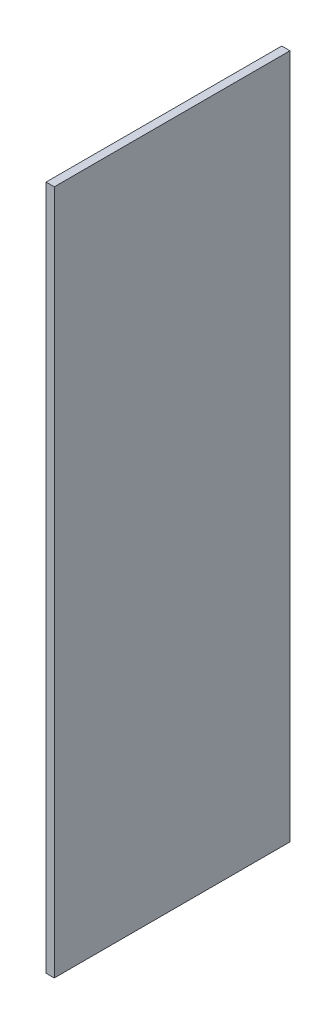
ISO-10303-21;
HEADER;
FILE_DESCRIPTION(('STEP AP214'),'2;1');
FILE_NAME('part.step','',(''),(''),'','','');
FILE_SCHEMA(('AUTOMOTIVE_DESIGN { 1 0 10303 214 1 1 1 1 }'));
ENDSEC;
DATA;
#1=APPLICATION_CONTEXT('core data for automotive mechanical design processes');
#2=APPLICATION_PROTOCOL_DEFINITION('international standard','automotive_design',2000,#1);
#3=PRODUCT_CONTEXT('',#1,'mechanical');
#4=PRODUCT('Part','Part','',(#3));
#5=PRODUCT_RELATED_PRODUCT_CATEGORY('part','',(#4));
#6=PRODUCT_DEFINITION_FORMATION('','',#4);
#7=PRODUCT_DEFINITION_CONTEXT('part definition',#1,'design');
#8=PRODUCT_DEFINITION('design','',#6,#7);
#9=PRODUCT_DEFINITION_SHAPE('','',#8);
#10=(LENGTH_UNIT() NAMED_UNIT(*) SI_UNIT(.MILLI.,.METRE.));
#11=(NAMED_UNIT(*) PLANE_ANGLE_UNIT() SI_UNIT($,.RADIAN.));
#12=(NAMED_UNIT(*) SI_UNIT($,.STERADIAN.) SOLID_ANGLE_UNIT());
#13=UNCERTAINTY_MEASURE_WITH_UNIT(LENGTH_MEASURE(1.E-05),#10,'distance_accuracy_value','');
#14=(GEOMETRIC_REPRESENTATION_CONTEXT(3) GLOBAL_UNCERTAINTY_ASSIGNED_CONTEXT((#13)) GLOBAL_UNIT_ASSIGNED_CONTEXT((#10,
#11,#12)) REPRESENTATION_CONTEXT('',''));
#15=CARTESIAN_POINT('',(0.,0.,0.));
#16=DIRECTION('',(0.,0.,1.));
#17=DIRECTION('',(1.,0.,0.));
#18=AXIS2_PLACEMENT_3D('',#15,#16,#17);
#19=CARTESIAN_POINT('',(3.,0.,0.));
#20=DIRECTION('',(0.,0.,-1.));
#21=DIRECTION('',(-1.,0.,0.));
#22=AXIS2_PLACEMENT_3D('',#19,#20,#21);
#23=PLANE('',#22);
#24=DIRECTION('',(0.,-1.,0.));
#25=VECTOR('',#24,1.);
#26=CARTESIAN_POINT('',(0.,0.,0.));
#27=LINE('',#26,#25);
#28=CARTESIAN_POINT('',(0.,250.,0.));
#29=VERTEX_POINT('',#28);
#30=CARTESIAN_POINT('',(0.,0.,0.));
#31=VERTEX_POINT('',#30);
#32=EDGE_CURVE('E96',#29,#31,#27,.T.);
#33=ORIENTED_EDGE('',*,*,#32,.T.);
#34=DIRECTION('',(-1.,0.,0.));
#35=VECTOR('',#34,1.);
#36=CARTESIAN_POINT('',(3.,0.,0.));
#37=LINE('',#36,#35);
#38=CARTESIAN_POINT('',(3.,0.,0.));
#39=VERTEX_POINT('',#38);
#40=EDGE_CURVE('E11',#39,#31,#37,.T.);
#41=ORIENTED_EDGE('',*,*,#40,.F.);
#42=DIRECTION('',(0.,-1.,0.));
#43=VECTOR('',#42,1.);
#44=CARTESIAN_POINT('',(3.,0.,0.));
#45=LINE('',#44,#43);
#46=CARTESIAN_POINT('',(3.,250.,0.));
#47=VERTEX_POINT('',#46);
#48=EDGE_CURVE('E84',#47,#39,#45,.T.);
#49=ORIENTED_EDGE('',*,*,#48,.F.);
#50=DIRECTION('',(-1.,0.,0.));
#51=VECTOR('',#50,1.);
#52=CARTESIAN_POINT('',(3.,250.,0.));
#53=LINE('',#52,#51);
#54=EDGE_CURVE('E92',#47,#29,#53,.T.);
#55=ORIENTED_EDGE('',*,*,#54,.T.);
#56=EDGE_LOOP('',(#33,#41,#49,#55));
#57=FACE_BOUND('',#56,.T.);
#58=ADVANCED_FACE('F33',(#57),#23,.F.);
#59=CARTESIAN_POINT('',(3.,0.,0.));
#60=DIRECTION('',(0.,1.,0.));
#61=DIRECTION('',(0.,0.,1.));
#62=AXIS2_PLACEMENT_3D('',#59,#60,#61);
#63=PLANE('',#62);
#64=DIRECTION('',(0.,0.,-1.));
#65=VECTOR('',#64,1.);
#66=CARTESIAN_POINT('',(0.,0.,0.));
#67=LINE('',#66,#65);
#68=CARTESIAN_POINT('',(0.,0.,-86.));
#69=VERTEX_POINT('',#68);
#70=EDGE_CURVE('E88',#31,#69,#67,.T.);
#71=ORIENTED_EDGE('',*,*,#70,.T.);
#72=DIRECTION('',(-1.,0.,0.));
#73=VECTOR('',#72,1.);
#74=CARTESIAN_POINT('',(3.,0.,-86.));
#75=LINE('',#74,#73);
#76=CARTESIAN_POINT('',(3.,0.,-86.));
#77=VERTEX_POINT('',#76);
#78=EDGE_CURVE('E41',#77,#69,#75,.T.);
#79=ORIENTED_EDGE('',*,*,#78,.F.);
#80=DIRECTION('',(0.,0.,-1.));
#81=VECTOR('',#80,1.);
#82=CARTESIAN_POINT('',(3.,0.,0.));
#83=LINE('',#82,#81);
#84=EDGE_CURVE('E79',#39,#77,#83,.T.);
#85=ORIENTED_EDGE('',*,*,#84,.F.);
#86=ORIENTED_EDGE('',*,*,#40,.T.);
#87=EDGE_LOOP('',(#71,#79,#85,#86));
#88=FACE_BOUND('',#87,.T.);
#89=ADVANCED_FACE('F87',(#88),#63,.F.);
#90=CARTESIAN_POINT('',(3.,0.,-86.));
#91=DIRECTION('',(0.,0.,1.));
#92=DIRECTION('',(1.,0.,0.));
#93=AXIS2_PLACEMENT_3D('',#90,#91,#92);
#94=PLANE('',#93);
#95=DIRECTION('',(0.,1.,0.));
#96=VECTOR('',#95,1.);
#97=CARTESIAN_POINT('',(0.,0.,-86.));
#98=LINE('',#97,#96);
#99=CARTESIAN_POINT('',(0.,250.,-86.));
#100=VERTEX_POINT('',#99);
#101=EDGE_CURVE('E66',#69,#100,#98,.T.);
#102=ORIENTED_EDGE('',*,*,#101,.T.);
#103=DIRECTION('',(-1.,0.,0.));
#104=VECTOR('',#103,1.);
#105=CARTESIAN_POINT('',(3.,250.,-86.));
#106=LINE('',#105,#104);
#107=CARTESIAN_POINT('',(3.,250.,-86.));
#108=VERTEX_POINT('',#107);
#109=EDGE_CURVE('E89',#108,#100,#106,.T.);
#110=ORIENTED_EDGE('',*,*,#109,.F.);
#111=DIRECTION('',(0.,1.,0.));
#112=VECTOR('',#111,1.);
#113=CARTESIAN_POINT('',(3.,0.,-86.));
#114=LINE('',#113,#112);
#115=EDGE_CURVE('E82',#77,#108,#114,.T.);
#116=ORIENTED_EDGE('',*,*,#115,.F.);
#117=ORIENTED_EDGE('',*,*,#78,.T.);
#118=EDGE_LOOP('',(#102,#110,#116,#117));
#119=FACE_BOUND('',#118,.T.);
#120=ADVANCED_FACE('F90',(#119),#94,.F.);
#121=CARTESIAN_POINT('',(3.,250.,0.));
#122=DIRECTION('',(0.,-1.,0.));
#123=DIRECTION('',(0.,0.,-1.));
#124=AXIS2_PLACEMENT_3D('',#121,#122,#123);
#125=PLANE('',#124);
#126=DIRECTION('',(0.,0.,1.));
#127=VECTOR('',#126,1.);
#128=CARTESIAN_POINT('',(0.,250.,0.));
#129=LINE('',#128,#127);
#130=EDGE_CURVE('E72',#100,#29,#129,.T.);
#131=ORIENTED_EDGE('',*,*,#130,.T.);
#132=ORIENTED_EDGE('',*,*,#54,.F.);
#133=DIRECTION('',(0.,0.,1.));
#134=VECTOR('',#133,1.);
#135=CARTESIAN_POINT('',(3.,250.,0.));
#136=LINE('',#135,#134);
#137=EDGE_CURVE('E49',#108,#47,#136,.T.);
#138=ORIENTED_EDGE('',*,*,#137,.F.);
#139=ORIENTED_EDGE('',*,*,#109,.T.);
#140=EDGE_LOOP('',(#131,#132,#138,#139));
#141=FACE_BOUND('',#140,.T.);
#142=ADVANCED_FACE('F103',(#141),#125,.F.);
#143=CARTESIAN_POINT('',(3.,0.,0.));
#144=DIRECTION('',(-1.,0.,0.));
#145=DIRECTION('',(0.,0.,1.));
#146=AXIS2_PLACEMENT_3D('',#143,#144,#145);
#147=PLANE('',#146);
#148=ORIENTED_EDGE('',*,*,#48,.T.);
#149=ORIENTED_EDGE('',*,*,#84,.T.);
#150=ORIENTED_EDGE('',*,*,#115,.T.);
#151=ORIENTED_EDGE('',*,*,#137,.T.);
#152=EDGE_LOOP('',(#148,#149,#150,#151));
#153=FACE_BOUND('',#152,.T.);
#154=ADVANCED_FACE('F80',(#153),#147,.F.);
#155=CARTESIAN_POINT('',(0.,0.,0.));
#156=DIRECTION('',(-1.,0.,0.));
#157=DIRECTION('',(0.,0.,1.));
#158=AXIS2_PLACEMENT_3D('',#155,#156,#157);
#159=PLANE('',#158);
#160=ORIENTED_EDGE('',*,*,#32,.F.);
#161=ORIENTED_EDGE('',*,*,#130,.F.);
#162=ORIENTED_EDGE('',*,*,#101,.F.);
#163=ORIENTED_EDGE('',*,*,#70,.F.);
#164=EDGE_LOOP('',(#160,#161,#162,#163));
#165=FACE_BOUND('',#164,.T.);
#166=ADVANCED_FACE('F106',(#165),#159,.T.);
#167=CLOSED_SHELL('',(#58,#89,#120,#142,#154,#166));
#168=MANIFOLD_SOLID_BREP('B2',#167);
#169=ADVANCED_BREP_SHAPE_REPRESENTATION('',(#18,#168),#14);
#170=SHAPE_DEFINITION_REPRESENTATION(#9,#169);
ENDSEC;
END-ISO-10303-21;
